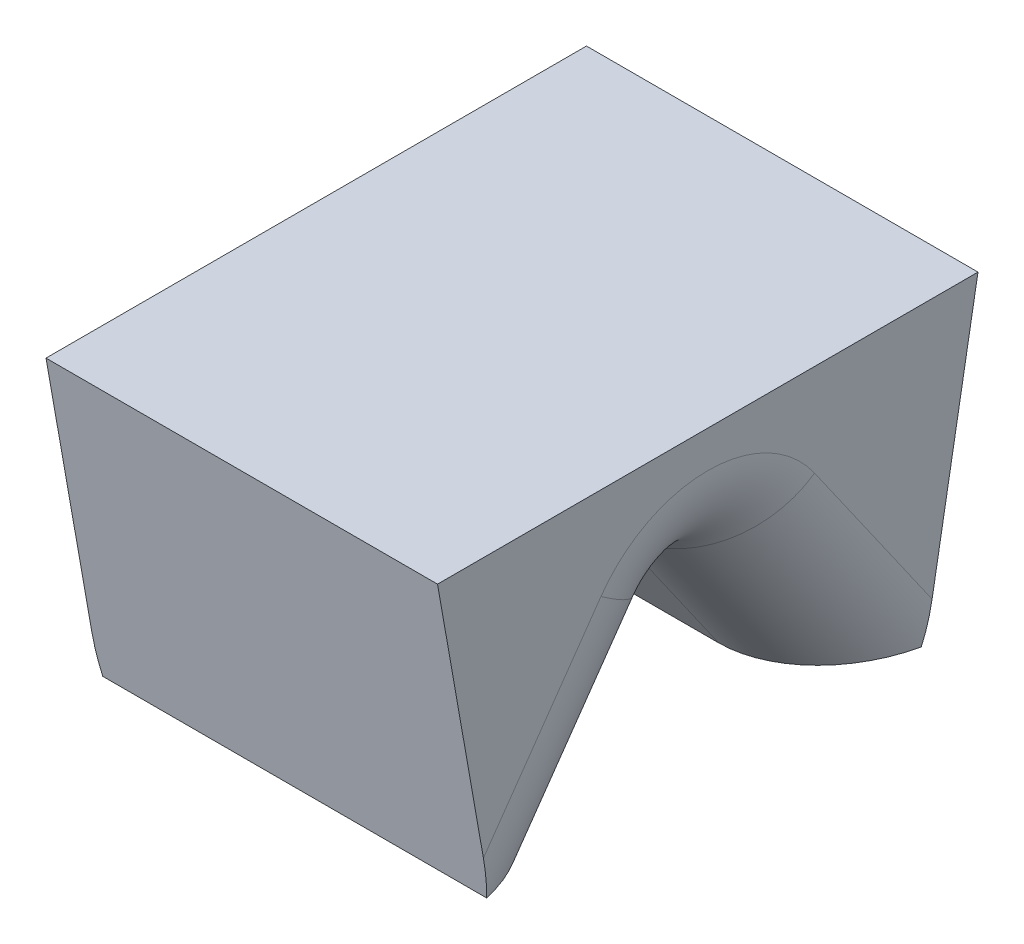
ISO-10303-21;
HEADER;
FILE_DESCRIPTION(('STEP AP214'),'2;1');
FILE_NAME('part.step','',(''),(''),'','','');
FILE_SCHEMA(('AUTOMOTIVE_DESIGN { 1 0 10303 214 1 1 1 1 }'));
ENDSEC;
DATA;
#1=APPLICATION_CONTEXT('core data for automotive mechanical design processes');
#2=APPLICATION_PROTOCOL_DEFINITION('international standard','automotive_design',2000,#1);
#3=PRODUCT_CONTEXT('',#1,'mechanical');
#4=PRODUCT('Part','Part','',(#3));
#5=PRODUCT_RELATED_PRODUCT_CATEGORY('part','',(#4));
#6=PRODUCT_DEFINITION_FORMATION('','',#4);
#7=PRODUCT_DEFINITION_CONTEXT('part definition',#1,'design');
#8=PRODUCT_DEFINITION('design','',#6,#7);
#9=PRODUCT_DEFINITION_SHAPE('','',#8);
#10=(LENGTH_UNIT() NAMED_UNIT(*) SI_UNIT(.MILLI.,.METRE.));
#11=(NAMED_UNIT(*) PLANE_ANGLE_UNIT() SI_UNIT($,.RADIAN.));
#12=(NAMED_UNIT(*) SI_UNIT($,.STERADIAN.) SOLID_ANGLE_UNIT());
#13=UNCERTAINTY_MEASURE_WITH_UNIT(LENGTH_MEASURE(1.E-05),#10,'distance_accuracy_value','');
#14=(GEOMETRIC_REPRESENTATION_CONTEXT(3) GLOBAL_UNCERTAINTY_ASSIGNED_CONTEXT((#13)) GLOBAL_UNIT_ASSIGNED_CONTEXT((#10,
#11,#12)) REPRESENTATION_CONTEXT('',''));
#15=CARTESIAN_POINT('',(0.,0.,0.));
#16=DIRECTION('',(0.,0.,1.));
#17=DIRECTION('',(1.,0.,0.));
#18=AXIS2_PLACEMENT_3D('',#15,#16,#17);
#19=CARTESIAN_POINT('',(0.,0.414017929910338,0.));
#20=DIRECTION('',(0.,1.,0.));
#21=DIRECTION('',(0.,0.,1.));
#22=AXIS2_PLACEMENT_3D('',#19,#20,#21);
#23=PLANE('',#22);
#24=DIRECTION('',(0.,0.,-1.));
#25=VECTOR('',#24,1.);
#26=CARTESIAN_POINT('',(-0.27178,0.414017929910338,1.50859998));
#27=LINE('',#26,#25);
#28=CARTESIAN_POINT('',(-0.27178,0.414017929910338,0.372722531540259));
#29=VERTEX_POINT('',#28);
#30=CARTESIAN_POINT('',(-0.27178,0.414017929910338,-0.372722531540259));
#31=VERTEX_POINT('',#30);
#32=EDGE_CURVE('E142',#29,#31,#27,.T.);
#33=ORIENTED_EDGE('',*,*,#32,.F.);
#34=DIRECTION('',(-1.,0.,0.));
#35=VECTOR('',#34,1.);
#36=CARTESIAN_POINT('',(1.50859998,0.414017929910338,0.372722531540259));
#37=LINE('',#36,#35);
#38=CARTESIAN_POINT('',(0.268219936,0.414017929910338,0.372722531540259));
#39=VERTEX_POINT('',#38);
#40=EDGE_CURVE('E57',#39,#29,#37,.T.);
#41=ORIENTED_EDGE('',*,*,#40,.F.);
#42=DIRECTION('',(0.,0.,1.));
#43=VECTOR('',#42,1.);
#44=CARTESIAN_POINT('',(0.268219936,0.414017929910338,1.50859998));
#45=LINE('',#44,#43);
#46=CARTESIAN_POINT('',(0.268219936,0.414017929910338,-0.372722531540259));
#47=VERTEX_POINT('',#46);
#48=EDGE_CURVE('E12',#47,#39,#45,.T.);
#49=ORIENTED_EDGE('',*,*,#48,.F.);
#50=DIRECTION('',(1.,0.,0.));
#51=VECTOR('',#50,1.);
#52=CARTESIAN_POINT('',(1.50859998,0.414017929910338,-0.372722531540259));
#53=LINE('',#52,#51);
#54=EDGE_CURVE('E129',#31,#47,#53,.T.);
#55=ORIENTED_EDGE('',*,*,#54,.F.);
#56=EDGE_LOOP('',(#33,#41,#49,#55));
#57=FACE_BOUND('',#56,.T.);
#58=ADVANCED_FACE('F42',(#57),#23,.T.);
#59=CARTESIAN_POINT('',(1.50859998,0.,-0.29972));
#60=DIRECTION('',(0.,-0.173648177666931,-0.984807753012208));
#61=DIRECTION('',(0.,0.984807753012208,-0.173648177666931));
#62=AXIS2_PLACEMENT_3D('',#59,#60,#61);
#63=PLANE('',#62);
#64=DIRECTION('',(0.,0.984807753012208,-0.173648177666931));
#65=VECTOR('',#64,1.);
#66=CARTESIAN_POINT('',(-0.27178,0.,-0.29972));
#67=LINE('',#66,#65);
#68=CARTESIAN_POINT('',(-0.27178,0.0550154466599009,-0.309420707601868));
#69=VERTEX_POINT('',#68);
#70=EDGE_CURVE('E141',#69,#31,#67,.T.);
#71=ORIENTED_EDGE('',*,*,#70,.T.);
#72=ORIENTED_EDGE('',*,*,#54,.T.);
#73=DIRECTION('',(0.,-0.984807753012208,0.173648177666931));
#74=VECTOR('',#73,1.);
#75=CARTESIAN_POINT('',(0.268219936,0.,-0.29972));
#76=LINE('',#75,#74);
#77=CARTESIAN_POINT('',(0.268219936,0.0550154466599009,-0.309420707601868));
#78=VERTEX_POINT('',#77);
#79=EDGE_CURVE('E138',#47,#78,#76,.T.);
#80=ORIENTED_EDGE('',*,*,#79,.T.);
#81=CARTESIAN_POINT('',(0.118359936,0.0550154466599009,-0.309420707601868));
#82=DIRECTION('',(0.,-0.173648177666931,-0.984807753012208));
#83=DIRECTION('',(0.,-0.984807753012208,0.173648177666931));
#84=AXIS2_PLACEMENT_3D('',#81,#82,#83);
#85=ELLIPSE('',#84,0.211934044457232,0.14986);
#86=CARTESIAN_POINT('',(0.26292002056838,0.,-0.29972));
#87=VERTEX_POINT('',#86);
#88=EDGE_CURVE('E250',#78,#87,#85,.T.);
#89=ORIENTED_EDGE('',*,*,#88,.T.);
#90=DIRECTION('',(-1.,0.,0.));
#91=VECTOR('',#90,1.);
#92=CARTESIAN_POINT('',(1.50859998,0.,-0.29972));
#93=LINE('',#92,#91);
#94=CARTESIAN_POINT('',(-0.266480084568381,0.,-0.29972));
#95=VERTEX_POINT('',#94);
#96=EDGE_CURVE('E157',#87,#95,#93,.T.);
#97=ORIENTED_EDGE('',*,*,#96,.T.);
#98=CARTESIAN_POINT('',(-0.12192,0.055015446659901,-0.309420707601868));
#99=DIRECTION('',(0.,-0.173648177666931,-0.984807753012208));
#100=DIRECTION('',(0.,0.984807753012208,-0.173648177666931));
#101=AXIS2_PLACEMENT_3D('',#98,#99,#100);
#102=ELLIPSE('',#101,0.211934044457232,0.14986);
#103=EDGE_CURVE('E243',#95,#69,#102,.T.);
#104=ORIENTED_EDGE('',*,*,#103,.T.);
#105=EDGE_LOOP('',(#71,#72,#80,#89,#97,#104));
#106=FACE_BOUND('',#105,.T.);
#107=ADVANCED_FACE('F137',(#106),#63,.T.);
#108=CARTESIAN_POINT('',(1.50859998,0.,0.29972));
#109=DIRECTION('',(0.,-0.173648177666931,0.984807753012208));
#110=DIRECTION('',(0.,-0.984807753012208,-0.173648177666931));
#111=AXIS2_PLACEMENT_3D('',#108,#109,#110);
#112=PLANE('',#111);
#113=DIRECTION('',(0.,0.984807753012208,0.173648177666931));
#114=VECTOR('',#113,1.);
#115=CARTESIAN_POINT('',(0.268219936,0.,0.29972));
#116=LINE('',#115,#114);
#117=CARTESIAN_POINT('',(0.268219936,0.0550154466599009,0.309420707601868));
#118=VERTEX_POINT('',#117);
#119=EDGE_CURVE('E148',#118,#39,#116,.T.);
#120=ORIENTED_EDGE('',*,*,#119,.T.);
#121=ORIENTED_EDGE('',*,*,#40,.T.);
#122=DIRECTION('',(0.,-0.984807753012208,-0.173648177666931));
#123=VECTOR('',#122,1.);
#124=CARTESIAN_POINT('',(-0.27178,0.,0.29972));
#125=LINE('',#124,#123);
#126=CARTESIAN_POINT('',(-0.27178,0.0550154466599009,0.309420707601868));
#127=VERTEX_POINT('',#126);
#128=EDGE_CURVE('E159',#29,#127,#125,.T.);
#129=ORIENTED_EDGE('',*,*,#128,.T.);
#130=CARTESIAN_POINT('',(-0.12192,0.0550154466599009,0.309420707601868));
#131=DIRECTION('',(0.,-0.173648177666931,0.984807753012208));
#132=DIRECTION('',(0.,-0.984807753012208,-0.173648177666931));
#133=AXIS2_PLACEMENT_3D('',#130,#131,#132);
#134=ELLIPSE('',#133,0.211934044457232,0.14986);
#135=CARTESIAN_POINT('',(-0.266480084568381,0.,0.29972));
#136=VERTEX_POINT('',#135);
#137=EDGE_CURVE('E297',#127,#136,#134,.T.);
#138=ORIENTED_EDGE('',*,*,#137,.T.);
#139=DIRECTION('',(-1.,0.,0.));
#140=VECTOR('',#139,1.);
#141=CARTESIAN_POINT('',(1.50859998,0.,0.29972));
#142=LINE('',#141,#140);
#143=CARTESIAN_POINT('',(0.262920020568381,0.,0.29972));
#144=VERTEX_POINT('',#143);
#145=EDGE_CURVE('E150',#144,#136,#142,.T.);
#146=ORIENTED_EDGE('',*,*,#145,.F.);
#147=CARTESIAN_POINT('',(0.118359936,0.0550154466599009,0.309420707601868));
#148=DIRECTION('',(0.,-0.173648177666931,0.984807753012208));
#149=DIRECTION('',(0.,0.984807753012208,0.173648177666931));
#150=AXIS2_PLACEMENT_3D('',#147,#148,#149);
#151=ELLIPSE('',#150,0.211934044457232,0.14986);
#152=EDGE_CURVE('E261',#144,#118,#151,.T.);
#153=ORIENTED_EDGE('',*,*,#152,.T.);
#154=EDGE_LOOP('',(#120,#121,#129,#138,#146,#153));
#155=FACE_BOUND('',#154,.T.);
#156=ADVANCED_FACE('F212',(#155),#112,.T.);
#157=CARTESIAN_POINT('',(-0.27178,0.81042002,1.50859998));
#158=DIRECTION('',(-1.,0.,0.));
#159=DIRECTION('',(0.,-1.,0.));
#160=AXIS2_PLACEMENT_3D('',#157,#158,#159);
#161=PLANE('',#160);
#162=ORIENTED_EDGE('',*,*,#128,.F.);
#163=ORIENTED_EDGE('',*,*,#32,.T.);
#164=ORIENTED_EDGE('',*,*,#70,.F.);
#165=DIRECTION('',(0.,-0.819152044288993,-0.573576436351044));
#166=VECTOR('',#165,1.);
#167=CARTESIAN_POINT('',(-0.27178,0.286536264194562,-0.147308085911624));
#168=LINE('',#167,#166);
#169=CARTESIAN_POINT('',(-0.27178,0.286536264194562,-0.147308085911624));
#170=VERTEX_POINT('',#169);
#171=EDGE_CURVE('E305',#69,#170,#168,.F.);
#172=ORIENTED_EDGE('',*,*,#171,.T.);
#173=CARTESIAN_POINT('',(-0.27178,0.183390032,0.));
#174=DIRECTION('',(-1.,0.,0.));
#175=DIRECTION('',(0.,-1.,0.));
#176=AXIS2_PLACEMENT_3D('',#173,#174,#175);
#177=CIRCLE('',#176,0.179829968);
#178=CARTESIAN_POINT('',(-0.27178,0.286536264194562,0.147308085911624));
#179=VERTEX_POINT('',#178);
#180=EDGE_CURVE('E303',#170,#179,#177,.F.);
#181=ORIENTED_EDGE('',*,*,#180,.T.);
#182=DIRECTION('',(0.,0.819152044288994,-0.573576436351044));
#183=VECTOR('',#182,1.);
#184=CARTESIAN_POINT('',(-0.27178,0.0859561647515674,0.287755783556462));
#185=LINE('',#184,#183);
#186=EDGE_CURVE('E300',#179,#127,#185,.F.);
#187=ORIENTED_EDGE('',*,*,#186,.T.);
#188=EDGE_LOOP('',(#162,#163,#164,#172,#181,#187));
#189=FACE_BOUND('',#188,.T.);
#190=ADVANCED_FACE('F330',(#189),#161,.T.);
#191=CARTESIAN_POINT('',(0.268219936,-0.00999998,1.50859998));
#192=DIRECTION('',(1.,0.,0.));
#193=DIRECTION('',(0.,1.,0.));
#194=AXIS2_PLACEMENT_3D('',#191,#192,#193);
#195=PLANE('',#194);
#196=ORIENTED_EDGE('',*,*,#79,.F.);
#197=ORIENTED_EDGE('',*,*,#48,.T.);
#198=ORIENTED_EDGE('',*,*,#119,.F.);
#199=DIRECTION('',(0.,-0.819152044288994,0.573576436351044));
#200=VECTOR('',#199,1.);
#201=CARTESIAN_POINT('',(0.268219936,0.286536264194562,0.147308085911624));
#202=LINE('',#201,#200);
#203=CARTESIAN_POINT('',(0.268219936,0.286536264194562,0.147308085911624));
#204=VERTEX_POINT('',#203);
#205=EDGE_CURVE('E247',#118,#204,#202,.F.);
#206=ORIENTED_EDGE('',*,*,#205,.T.);
#207=CARTESIAN_POINT('',(0.268219936,0.183390032,0.));
#208=DIRECTION('',(1.,0.,0.));
#209=DIRECTION('',(0.,1.,0.));
#210=AXIS2_PLACEMENT_3D('',#207,#208,#209);
#211=CIRCLE('',#210,0.179829968);
#212=CARTESIAN_POINT('',(0.268219936,0.286536264194562,-0.147308085911624));
#213=VERTEX_POINT('',#212);
#214=EDGE_CURVE('E242',#204,#213,#211,.F.);
#215=ORIENTED_EDGE('',*,*,#214,.T.);
#216=DIRECTION('',(0.,0.819152044288993,0.573576436351044));
#217=VECTOR('',#216,1.);
#218=CARTESIAN_POINT('',(0.268219936,0.0859561647515674,-0.287755783556462));
#219=LINE('',#218,#217);
#220=EDGE_CURVE('E146',#213,#78,#219,.F.);
#221=ORIENTED_EDGE('',*,*,#220,.T.);
#222=EDGE_LOOP('',(#196,#197,#198,#206,#215,#221));
#223=FACE_BOUND('',#222,.T.);
#224=ADVANCED_FACE('F144',(#223),#195,.T.);
#225=CARTESIAN_POINT('',(0.,0.,0.));
#226=DIRECTION('',(0.,1.,0.));
#227=DIRECTION('',(0.,0.,1.));
#228=AXIS2_PLACEMENT_3D('',#225,#226,#227);
#229=PLANE('',#228);
#230=ORIENTED_EDGE('',*,*,#96,.F.);
#231=CARTESIAN_POINT('',(0.118359936,0.,-0.347942938071105));
#232=DIRECTION('',(0.,1.,0.));
#233=DIRECTION('',(0.,0.,-1.));
#234=AXIS2_PLACEMENT_3D('',#231,#232,#233);
#235=ELLIPSE('',#234,0.182945279871791,0.14986);
#236=CARTESIAN_POINT('',(0.118359936,0.,-0.164997658199313));
#237=VERTEX_POINT('',#236);
#238=EDGE_CURVE('E252',#87,#237,#235,.F.);
#239=ORIENTED_EDGE('',*,*,#238,.T.);
#240=CARTESIAN_POINT('',(0.118359936,0.,-0.164997658199313));
#241=DIRECTION('',(-1.,0.,0.));
#242=VECTOR('',#241,1.);
#243=LINE('',#240,#242);
#244=CARTESIAN_POINT('',(-0.12192,0.,-0.164997658199313));
#245=VERTEX_POINT('',#244);
#246=EDGE_CURVE('E237',#237,#245,#243,.T.);
#247=ORIENTED_EDGE('',*,*,#246,.T.);
#248=CARTESIAN_POINT('',(-0.12192,0.,-0.347942938071105));
#249=DIRECTION('',(0.,1.,0.));
#250=DIRECTION('',(0.,0.,1.));
#251=AXIS2_PLACEMENT_3D('',#248,#249,#250);
#252=ELLIPSE('',#251,0.182945279871791,0.14986);
#253=EDGE_CURVE('E282',#245,#95,#252,.F.);
#254=ORIENTED_EDGE('',*,*,#253,.T.);
#255=EDGE_LOOP('',(#230,#239,#247,#254));
#256=FACE_BOUND('',#255,.T.);
#257=ADVANCED_FACE('F180',(#256),#229,.F.);
#258=CARTESIAN_POINT('',(-0.12192,0.,0.164997658199313));
#259=DIRECTION('',(1.,0.,0.));
#260=VECTOR('',#259,1.);
#261=LINE('',#258,#260);
#262=CARTESIAN_POINT('',(-0.12192,0.,0.164997658199313));
#263=VERTEX_POINT('',#262);
#264=CARTESIAN_POINT('',(0.118359936,0.,0.164997658199313));
#265=VERTEX_POINT('',#264);
#266=EDGE_CURVE('E161',#263,#265,#261,.T.);
#267=ORIENTED_EDGE('',*,*,#266,.T.);
#268=CARTESIAN_POINT('',(0.118359936,0.,0.347942938071105));
#269=DIRECTION('',(0.,1.,0.));
#270=DIRECTION('',(0.,0.,-1.));
#271=AXIS2_PLACEMENT_3D('',#268,#269,#270);
#272=ELLIPSE('',#271,0.182945279871791,0.14986);
#273=EDGE_CURVE('E64',#265,#144,#272,.F.);
#274=ORIENTED_EDGE('',*,*,#273,.T.);
#275=ORIENTED_EDGE('',*,*,#145,.T.);
#276=CARTESIAN_POINT('',(-0.12192,0.,0.347942938071105));
#277=DIRECTION('',(0.,1.,0.));
#278=DIRECTION('',(0.,0.,1.));
#279=AXIS2_PLACEMENT_3D('',#276,#277,#278);
#280=ELLIPSE('',#279,0.182945279871791,0.14986);
#281=EDGE_CURVE('E293',#136,#263,#280,.F.);
#282=ORIENTED_EDGE('',*,*,#281,.T.);
#283=EDGE_LOOP('',(#267,#274,#275,#282));
#284=FACE_BOUND('',#283,.T.);
#285=ADVANCED_FACE('F169',(#284),#229,.F.);
#286=CARTESIAN_POINT('',(-1.20142,0.200580099442995,-0.0245499605544758));
#287=DIRECTION('',(0.,0.573576436351044,-0.819152044288993));
#288=DIRECTION('',(0.,0.819152044288993,0.573576436351044));
#289=AXIS2_PLACEMENT_3D('',#286,#287,#288);
#290=PLANE('',#289);
#291=ORIENTED_EDGE('',*,*,#246,.F.);
#292=DIRECTION('',(0.,0.819152044288993,0.573576436351044));
#293=VECTOR('',#292,1.);
#294=CARTESIAN_POINT('',(0.118359936,0.200580099442995,-0.0245499605544758));
#295=LINE('',#294,#293);
#296=CARTESIAN_POINT('',(0.118359936,0.200580099442995,-0.0245499605544758));
#297=VERTEX_POINT('',#296);
#298=EDGE_CURVE('E240',#237,#297,#295,.T.);
#299=ORIENTED_EDGE('',*,*,#298,.T.);
#300=DIRECTION('',(1.,0.,0.));
#301=VECTOR('',#300,1.);
#302=CARTESIAN_POINT('',(-1.20142,0.200580099442995,-0.0245499605544758));
#303=LINE('',#302,#301);
#304=CARTESIAN_POINT('',(-0.12192,0.200580099442995,-0.0245499605544758));
#305=VERTEX_POINT('',#304);
#306=EDGE_CURVE('E279',#305,#297,#303,.T.);
#307=ORIENTED_EDGE('',*,*,#306,.F.);
#308=DIRECTION('',(0.,-0.819152044288993,-0.573576436351044));
#309=VECTOR('',#308,1.);
#310=CARTESIAN_POINT('',(-0.12192,0.,-0.164997658199313));
#311=LINE('',#310,#309);
#312=EDGE_CURVE('E287',#305,#245,#311,.T.);
#313=ORIENTED_EDGE('',*,*,#312,.T.);
#314=EDGE_LOOP('',(#291,#299,#307,#313));
#315=FACE_BOUND('',#314,.T.);
#316=ADVANCED_FACE('F179',(#315),#290,.F.);
#317=CARTESIAN_POINT('',(-1.20142,-0.00999998000000013,0.171999719577259));
#318=DIRECTION('',(0.,0.573576436351044,0.819152044288994));
#319=DIRECTION('',(0.,-0.819152044288994,0.573576436351044));
#320=AXIS2_PLACEMENT_3D('',#317,#318,#319);
#321=PLANE('',#320);
#322=DIRECTION('',(1.,0.,0.));
#323=VECTOR('',#322,1.);
#324=CARTESIAN_POINT('',(-1.20142,0.200580099442995,0.0245499605544758));
#325=LINE('',#324,#323);
#326=CARTESIAN_POINT('',(-0.12192,0.200580099442995,0.0245499605544758));
#327=VERTEX_POINT('',#326);
#328=CARTESIAN_POINT('',(0.118359936,0.200580099442995,0.0245499605544758));
#329=VERTEX_POINT('',#328);
#330=EDGE_CURVE('E152',#327,#329,#325,.T.);
#331=ORIENTED_EDGE('',*,*,#330,.T.);
#332=DIRECTION('',(0.,-0.819152044288994,0.573576436351044));
#333=VECTOR('',#332,1.);
#334=CARTESIAN_POINT('',(0.118359936,0.,0.164997658199313));
#335=LINE('',#334,#333);
#336=EDGE_CURVE('E254',#329,#265,#335,.T.);
#337=ORIENTED_EDGE('',*,*,#336,.T.);
#338=ORIENTED_EDGE('',*,*,#266,.F.);
#339=DIRECTION('',(0.,0.819152044288994,-0.573576436351044));
#340=VECTOR('',#339,1.);
#341=CARTESIAN_POINT('',(-0.12192,0.200580099442995,0.0245499605544759));
#342=LINE('',#341,#340);
#343=EDGE_CURVE('E307',#263,#327,#342,.T.);
#344=ORIENTED_EDGE('',*,*,#343,.T.);
#345=EDGE_LOOP('',(#331,#337,#338,#344));
#346=FACE_BOUND('',#345,.T.);
#347=ADVANCED_FACE('F217',(#346),#321,.F.);
#348=CARTESIAN_POINT('',(-1.20142,0.183390032,0.));
#349=DIRECTION('',(1.,0.,0.));
#350=DIRECTION('',(0.,0.,-1.));
#351=AXIS2_PLACEMENT_3D('',#348,#349,#350);
#352=CYLINDRICAL_SURFACE('',#351,0.0299699680000002);
#353=ORIENTED_EDGE('',*,*,#306,.T.);
#354=CARTESIAN_POINT('',(0.118359936,0.183390032,0.));
#355=DIRECTION('',(1.,0.,0.));
#356=DIRECTION('',(0.,1.,0.));
#357=AXIS2_PLACEMENT_3D('',#354,#355,#356);
#358=CIRCLE('',#357,0.0299699680000002);
#359=EDGE_CURVE('E50',#297,#329,#358,.T.);
#360=ORIENTED_EDGE('',*,*,#359,.T.);
#361=ORIENTED_EDGE('',*,*,#330,.F.);
#362=CARTESIAN_POINT('',(-0.12192,0.183390032,0.));
#363=DIRECTION('',(-1.,0.,0.));
#364=DIRECTION('',(0.,-1.,0.));
#365=AXIS2_PLACEMENT_3D('',#362,#363,#364);
#366=CIRCLE('',#365,0.0299699680000002);
#367=EDGE_CURVE('E291',#327,#305,#366,.T.);
#368=ORIENTED_EDGE('',*,*,#367,.T.);
#369=EDGE_LOOP('',(#353,#360,#361,#368));
#370=FACE_BOUND('',#369,.T.);
#371=ADVANCED_FACE('F194',(#370),#352,.F.);
#372=CARTESIAN_POINT('',(-0.12192,0.286536264194562,-0.147308085911624));
#373=DIRECTION('',(0.,0.819152044288993,0.573576436351044));
#374=DIRECTION('',(0.,-0.573576436351044,0.819152044288993));
#375=AXIS2_PLACEMENT_3D('',#372,#373,#374);
#376=CYLINDRICAL_SURFACE('',#375,0.14986);
#377=ORIENTED_EDGE('',*,*,#253,.F.);
#378=ORIENTED_EDGE('',*,*,#312,.F.);
#379=CARTESIAN_POINT('',(-0.12192,0.286536264194562,-0.147308085911624));
#380=DIRECTION('',(0.,0.819152044288992,0.573576436351045));
#381=DIRECTION('',(0.,-0.573576436351045,0.819152044288992));
#382=AXIS2_PLACEMENT_3D('',#379,#380,#381);
#383=CIRCLE('',#382,0.14986);
#384=EDGE_CURVE('E272',#170,#305,#383,.T.);
#385=ORIENTED_EDGE('',*,*,#384,.F.);
#386=ORIENTED_EDGE('',*,*,#171,.F.);
#387=ORIENTED_EDGE('',*,*,#103,.F.);
#388=EDGE_LOOP('',(#377,#378,#385,#386,#387));
#389=FACE_BOUND('',#388,.T.);
#390=ADVANCED_FACE('F190',(#389),#376,.T.);
#391=CARTESIAN_POINT('',(-0.12192,0.183390032,0.));
#392=DIRECTION('',(-1.,0.,0.));
#393=DIRECTION('',(0.,-1.,0.));
#394=AXIS2_PLACEMENT_3D('',#391,#392,#393);
#395=TOROIDAL_SURFACE('',#394,0.179829968,0.14986);
#396=ORIENTED_EDGE('',*,*,#384,.T.);
#397=ORIENTED_EDGE('',*,*,#367,.F.);
#398=CARTESIAN_POINT('',(-0.12192,0.286536264194562,0.147308085911624));
#399=DIRECTION('',(0.,-0.819152044288994,0.573576436351044));
#400=DIRECTION('',(0.,-0.573576436351044,-0.819152044288994));
#401=AXIS2_PLACEMENT_3D('',#398,#399,#400);
#402=CIRCLE('',#401,0.14986);
#403=EDGE_CURVE('E268',#179,#327,#402,.T.);
#404=ORIENTED_EDGE('',*,*,#403,.F.);
#405=ORIENTED_EDGE('',*,*,#180,.F.);
#406=EDGE_LOOP('',(#396,#397,#404,#405));
#407=FACE_BOUND('',#406,.T.);
#408=ADVANCED_FACE('F186',(#407),#395,.T.);
#409=CARTESIAN_POINT('',(-0.12192,0.0759561847515674,0.294757844934408));
#410=DIRECTION('',(0.,-0.819152044288994,0.573576436351044));
#411=DIRECTION('',(0.,-0.573576436351044,-0.819152044288994));
#412=AXIS2_PLACEMENT_3D('',#409,#410,#411);
#413=CYLINDRICAL_SURFACE('',#412,0.14986);
#414=ORIENTED_EDGE('',*,*,#137,.F.);
#415=ORIENTED_EDGE('',*,*,#186,.F.);
#416=ORIENTED_EDGE('',*,*,#403,.T.);
#417=ORIENTED_EDGE('',*,*,#343,.F.);
#418=ORIENTED_EDGE('',*,*,#281,.F.);
#419=EDGE_LOOP('',(#414,#415,#416,#417,#418));
#420=FACE_BOUND('',#419,.T.);
#421=ADVANCED_FACE('F182',(#420),#413,.T.);
#422=CARTESIAN_POINT('',(0.118359936,0.0759561847515672,0.294757844934408));
#423=DIRECTION('',(0.,0.819152044288994,-0.573576436351044));
#424=DIRECTION('',(0.,0.573576436351044,0.819152044288994));
#425=AXIS2_PLACEMENT_3D('',#422,#423,#424);
#426=CYLINDRICAL_SURFACE('',#425,0.14986);
#427=ORIENTED_EDGE('',*,*,#273,.F.);
#428=ORIENTED_EDGE('',*,*,#336,.F.);
#429=CARTESIAN_POINT('',(0.118359936,0.286536264194562,0.147308085911624));
#430=DIRECTION('',(0.,0.819152044288993,-0.573576436351043));
#431=DIRECTION('',(0.,0.573576436351044,0.819152044288994));
#432=AXIS2_PLACEMENT_3D('',#429,#430,#431);
#433=CIRCLE('',#432,0.14986);
#434=EDGE_CURVE('E267',#204,#329,#433,.T.);
#435=ORIENTED_EDGE('',*,*,#434,.F.);
#436=ORIENTED_EDGE('',*,*,#205,.F.);
#437=ORIENTED_EDGE('',*,*,#152,.F.);
#438=EDGE_LOOP('',(#427,#428,#435,#436,#437));
#439=FACE_BOUND('',#438,.T.);
#440=ADVANCED_FACE('F44',(#439),#426,.T.);
#441=CARTESIAN_POINT('',(0.118359936,0.183390032,0.));
#442=DIRECTION('',(1.,0.,0.));
#443=DIRECTION('',(0.,1.,0.));
#444=AXIS2_PLACEMENT_3D('',#441,#442,#443);
#445=TOROIDAL_SURFACE('',#444,0.179829968,0.14986);
#446=ORIENTED_EDGE('',*,*,#434,.T.);
#447=ORIENTED_EDGE('',*,*,#359,.F.);
#448=CARTESIAN_POINT('',(0.118359936,0.286536264194562,-0.147308085911624));
#449=DIRECTION('',(0.,-0.819152044288993,-0.573576436351044));
#450=DIRECTION('',(0.,0.573576436351044,-0.819152044288993));
#451=AXIS2_PLACEMENT_3D('',#448,#449,#450);
#452=CIRCLE('',#451,0.14986);
#453=EDGE_CURVE('E266',#213,#297,#452,.T.);
#454=ORIENTED_EDGE('',*,*,#453,.F.);
#455=ORIENTED_EDGE('',*,*,#214,.F.);
#456=EDGE_LOOP('',(#446,#447,#454,#455));
#457=FACE_BOUND('',#456,.T.);
#458=ADVANCED_FACE('F198',(#457),#445,.T.);
#459=CARTESIAN_POINT('',(0.118359936,0.286536264194562,-0.147308085911624));
#460=DIRECTION('',(0.,-0.819152044288993,-0.573576436351044));
#461=DIRECTION('',(0.,0.573576436351044,-0.819152044288993));
#462=AXIS2_PLACEMENT_3D('',#459,#460,#461);
#463=CYLINDRICAL_SURFACE('',#462,0.14986);
#464=ORIENTED_EDGE('',*,*,#88,.F.);
#465=ORIENTED_EDGE('',*,*,#220,.F.);
#466=ORIENTED_EDGE('',*,*,#453,.T.);
#467=ORIENTED_EDGE('',*,*,#298,.F.);
#468=ORIENTED_EDGE('',*,*,#238,.F.);
#469=EDGE_LOOP('',(#464,#465,#466,#467,#468));
#470=FACE_BOUND('',#469,.T.);
#471=ADVANCED_FACE('F196',(#470),#463,.T.);
#472=CLOSED_SHELL('',(#58,#107,#156,#190,#224,#257,#285,#316,#347,#371,#390,#408,#421,#440,#458,#471));
#473=MANIFOLD_SOLID_BREP('B2',#472);
#474=ADVANCED_BREP_SHAPE_REPRESENTATION('',(#18,#473),#14);
#475=SHAPE_DEFINITION_REPRESENTATION(#9,#474);
ENDSEC;
END-ISO-10303-21;
